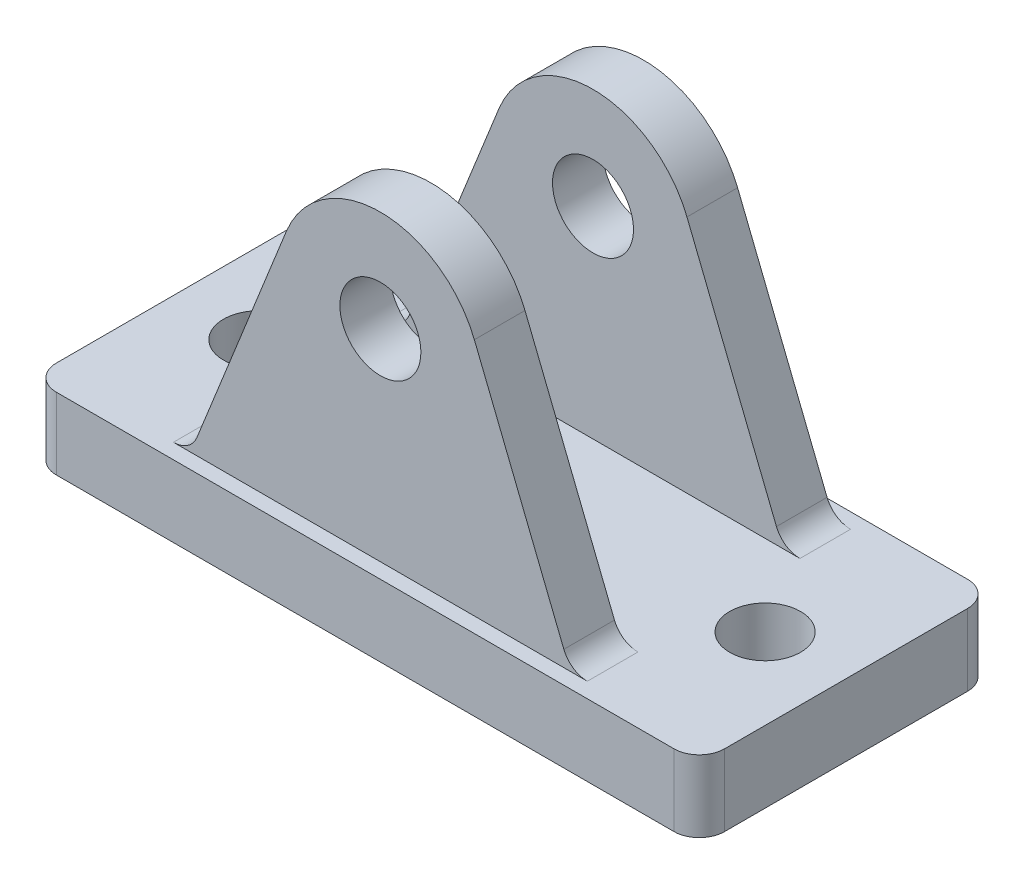
ISO-10303-21;
HEADER;
FILE_DESCRIPTION(('STEP AP214'),'2;1');
FILE_NAME('part.step','',(''),(''),'','','');
FILE_SCHEMA(('AUTOMOTIVE_DESIGN { 1 0 10303 214 1 1 1 1 }'));
ENDSEC;
DATA;
#1=APPLICATION_CONTEXT('core data for automotive mechanical design processes');
#2=APPLICATION_PROTOCOL_DEFINITION('international standard','automotive_design',2000,#1);
#3=PRODUCT_CONTEXT('',#1,'mechanical');
#4=PRODUCT('Part','Part','',(#3));
#5=PRODUCT_RELATED_PRODUCT_CATEGORY('part','',(#4));
#6=PRODUCT_DEFINITION_FORMATION('','',#4);
#7=PRODUCT_DEFINITION_CONTEXT('part definition',#1,'design');
#8=PRODUCT_DEFINITION('design','',#6,#7);
#9=PRODUCT_DEFINITION_SHAPE('','',#8);
#10=(LENGTH_UNIT() NAMED_UNIT(*) SI_UNIT(.MILLI.,.METRE.));
#11=(NAMED_UNIT(*) PLANE_ANGLE_UNIT() SI_UNIT($,.RADIAN.));
#12=(NAMED_UNIT(*) SI_UNIT($,.STERADIAN.) SOLID_ANGLE_UNIT());
#13=UNCERTAINTY_MEASURE_WITH_UNIT(LENGTH_MEASURE(1.E-05),#10,'distance_accuracy_value','');
#14=(GEOMETRIC_REPRESENTATION_CONTEXT(3) GLOBAL_UNCERTAINTY_ASSIGNED_CONTEXT((#13)) GLOBAL_UNIT_ASSIGNED_CONTEXT((#10,
#11,#12)) REPRESENTATION_CONTEXT('',''));
#15=CARTESIAN_POINT('',(0.,0.,0.));
#16=DIRECTION('',(0.,0.,1.));
#17=DIRECTION('',(1.,0.,0.));
#18=AXIS2_PLACEMENT_3D('',#15,#16,#17);
#19=CARTESIAN_POINT('',(0.,14.1675953124891,0.));
#20=DIRECTION('',(0.,-1.,0.));
#21=DIRECTION('',(0.,0.,-1.));
#22=AXIS2_PLACEMENT_3D('',#19,#20,#21);
#23=PLANE('',#22);
#24=DIRECTION('',(1.,0.,0.));
#25=VECTOR('',#24,1.);
#26=CARTESIAN_POINT('',(37.5,14.1675953124891,-16.));
#27=LINE('',#26,#25);
#28=CARTESIAN_POINT('',(-40.8834112643357,14.1675953124891,-16.));
#29=VERTEX_POINT('',#28);
#30=CARTESIAN_POINT('',(40.8834112643357,14.1675953124891,-16.));
#31=VERTEX_POINT('',#30);
#32=EDGE_CURVE('E189',#29,#31,#27,.T.);
#33=ORIENTED_EDGE('',*,*,#32,.F.);
#34=DIRECTION('',(0.,0.,1.));
#35=VECTOR('',#34,1.);
#36=CARTESIAN_POINT('',(-40.8834112643357,14.1675953124891,0.));
#37=LINE('',#36,#35);
#38=CARTESIAN_POINT('',(-40.8834112643357,14.1675953124891,-26.));
#39=VERTEX_POINT('',#38);
#40=EDGE_CURVE('E302',#29,#39,#37,.F.);
#41=ORIENTED_EDGE('',*,*,#40,.T.);
#42=DIRECTION('',(1.,0.,0.));
#43=VECTOR('',#42,1.);
#44=CARTESIAN_POINT('',(37.5,14.1675953124891,-26.));
#45=LINE('',#44,#43);
#46=CARTESIAN_POINT('',(40.8834112643357,14.1675953124891,-26.));
#47=VERTEX_POINT('',#46);
#48=EDGE_CURVE('E197',#39,#47,#45,.T.);
#49=ORIENTED_EDGE('',*,*,#48,.T.);
#50=DIRECTION('',(0.,0.,1.));
#51=VECTOR('',#50,1.);
#52=CARTESIAN_POINT('',(40.8834112643357,14.1675953124891,0.));
#53=LINE('',#52,#51);
#54=EDGE_CURVE('E299',#47,#31,#53,.T.);
#55=ORIENTED_EDGE('',*,*,#54,.T.);
#56=EDGE_LOOP('',(#33,#41,#49,#55));
#57=FACE_BOUND('',#56,.T.);
#58=DIRECTION('',(1.,0.,0.));
#59=VECTOR('',#58,1.);
#60=CARTESIAN_POINT('',(-66.,14.1675953124891,-29.));
#61=LINE('',#60,#59);
#62=CARTESIAN_POINT('',(-61.,14.1675953124891,-29.));
#63=VERTEX_POINT('',#62);
#64=CARTESIAN_POINT('',(61.,14.1675953124891,-29.));
#65=VERTEX_POINT('',#64);
#66=EDGE_CURVE('E263',#63,#65,#61,.T.);
#67=ORIENTED_EDGE('',*,*,#66,.F.);
#68=CARTESIAN_POINT('',(-61.,14.1675953124891,-24.));
#69=DIRECTION('',(0.,-1.,0.));
#70=DIRECTION('',(0.,0.,-1.));
#71=AXIS2_PLACEMENT_3D('',#68,#69,#70);
#72=CIRCLE('',#71,5.);
#73=CARTESIAN_POINT('',(-66.,14.1675953124891,-24.));
#74=VERTEX_POINT('',#73);
#75=EDGE_CURVE('E291',#63,#74,#72,.F.);
#76=ORIENTED_EDGE('',*,*,#75,.T.);
#77=DIRECTION('',(0.,0.,-1.));
#78=VECTOR('',#77,1.);
#79=CARTESIAN_POINT('',(-66.,14.1675953124891,29.));
#80=LINE('',#79,#78);
#81=CARTESIAN_POINT('',(-66.,14.1675953124891,24.));
#82=VERTEX_POINT('',#81);
#83=EDGE_CURVE('E260',#82,#74,#80,.T.);
#84=ORIENTED_EDGE('',*,*,#83,.F.);
#85=CARTESIAN_POINT('',(-61.,14.1675953124891,24.));
#86=DIRECTION('',(0.,-1.,0.));
#87=DIRECTION('',(0.,0.,-1.));
#88=AXIS2_PLACEMENT_3D('',#85,#86,#87);
#89=CIRCLE('',#88,5.);
#90=CARTESIAN_POINT('',(-61.,14.1675953124891,29.));
#91=VERTEX_POINT('',#90);
#92=EDGE_CURVE('E287',#82,#91,#89,.F.);
#93=ORIENTED_EDGE('',*,*,#92,.T.);
#94=DIRECTION('',(1.,0.,0.));
#95=VECTOR('',#94,1.);
#96=CARTESIAN_POINT('',(-66.,14.1675953124891,29.));
#97=LINE('',#96,#95);
#98=CARTESIAN_POINT('',(61.,14.1675953124891,29.));
#99=VERTEX_POINT('',#98);
#100=EDGE_CURVE('E270',#91,#99,#97,.T.);
#101=ORIENTED_EDGE('',*,*,#100,.T.);
#102=CARTESIAN_POINT('',(61.,14.1675953124891,24.));
#103=DIRECTION('',(0.,-1.,0.));
#104=DIRECTION('',(0.,0.,-1.));
#105=AXIS2_PLACEMENT_3D('',#102,#103,#104);
#106=CIRCLE('',#105,5.);
#107=CARTESIAN_POINT('',(66.,14.1675953124891,24.));
#108=VERTEX_POINT('',#107);
#109=EDGE_CURVE('E285',#99,#108,#106,.F.);
#110=ORIENTED_EDGE('',*,*,#109,.T.);
#111=DIRECTION('',(0.,0.,-1.));
#112=VECTOR('',#111,1.);
#113=CARTESIAN_POINT('',(66.,14.1675953124891,29.));
#114=LINE('',#113,#112);
#115=CARTESIAN_POINT('',(66.,14.1675953124891,-24.));
#116=VERTEX_POINT('',#115);
#117=EDGE_CURVE('E267',#108,#116,#114,.T.);
#118=ORIENTED_EDGE('',*,*,#117,.T.);
#119=CARTESIAN_POINT('',(61.,14.1675953124891,-24.));
#120=DIRECTION('',(0.,-1.,0.));
#121=DIRECTION('',(0.,0.,-1.));
#122=AXIS2_PLACEMENT_3D('',#119,#120,#121);
#123=CIRCLE('',#122,5.);
#124=EDGE_CURVE('E289',#116,#65,#123,.F.);
#125=ORIENTED_EDGE('',*,*,#124,.T.);
#126=EDGE_LOOP('',(#67,#76,#84,#93,#101,#110,#118,#125));
#127=FACE_BOUND('',#126,.T.);
#128=CARTESIAN_POINT('',(50.,14.1675953124891,0.));
#129=DIRECTION('',(0.,1.,0.));
#130=DIRECTION('',(0.,0.,-1.));
#131=AXIS2_PLACEMENT_3D('',#128,#129,#130);
#132=CIRCLE('',#131,7.);
#133=CARTESIAN_POINT('',(50.,14.1675953124891,-7.));
#134=VERTEX_POINT('',#133);
#135=EDGE_CURVE('E255',#134,#134,#132,.T.);
#136=ORIENTED_EDGE('',*,*,#135,.F.);
#137=EDGE_LOOP('',(#136));
#138=FACE_BOUND('',#137,.T.);
#139=CARTESIAN_POINT('',(-50.,14.1675953124891,0.));
#140=DIRECTION('',(0.,1.,0.));
#141=DIRECTION('',(0.,0.,1.));
#142=AXIS2_PLACEMENT_3D('',#139,#140,#141);
#143=CIRCLE('',#142,7.);
#144=CARTESIAN_POINT('',(-50.,14.1675953124891,7.));
#145=VERTEX_POINT('',#144);
#146=EDGE_CURVE('E252',#145,#145,#143,.T.);
#147=ORIENTED_EDGE('',*,*,#146,.F.);
#148=EDGE_LOOP('',(#147));
#149=FACE_BOUND('',#148,.T.);
#150=DIRECTION('',(1.,0.,0.));
#151=VECTOR('',#150,1.);
#152=CARTESIAN_POINT('',(37.5,14.1675953124891,16.));
#153=LINE('',#152,#151);
#154=CARTESIAN_POINT('',(-40.8834112643357,14.1675953124891,16.));
#155=VERTEX_POINT('',#154);
#156=CARTESIAN_POINT('',(40.8834112643357,14.1675953124891,16.));
#157=VERTEX_POINT('',#156);
#158=EDGE_CURVE('E227',#155,#157,#153,.T.);
#159=ORIENTED_EDGE('',*,*,#158,.T.);
#160=DIRECTION('',(0.,0.,-1.));
#161=VECTOR('',#160,1.);
#162=CARTESIAN_POINT('',(40.8834112643357,14.1675953124891,26.));
#163=LINE('',#162,#161);
#164=CARTESIAN_POINT('',(40.8834112643357,14.1675953124891,26.));
#165=VERTEX_POINT('',#164);
#166=EDGE_CURVE('E296',#157,#165,#163,.F.);
#167=ORIENTED_EDGE('',*,*,#166,.T.);
#168=DIRECTION('',(1.,0.,0.));
#169=VECTOR('',#168,1.);
#170=CARTESIAN_POINT('',(37.5,14.1675953124891,26.));
#171=LINE('',#170,#169);
#172=CARTESIAN_POINT('',(-40.8834112643357,14.1675953124891,26.));
#173=VERTEX_POINT('',#172);
#174=EDGE_CURVE('E232',#173,#165,#171,.T.);
#175=ORIENTED_EDGE('',*,*,#174,.F.);
#176=DIRECTION('',(0.,0.,-1.));
#177=VECTOR('',#176,1.);
#178=CARTESIAN_POINT('',(-40.8834112643357,14.1675953124891,16.));
#179=LINE('',#178,#177);
#180=EDGE_CURVE('E293',#173,#155,#179,.T.);
#181=ORIENTED_EDGE('',*,*,#180,.T.);
#182=EDGE_LOOP('',(#159,#167,#175,#181));
#183=FACE_BOUND('',#182,.T.);
#184=ADVANCED_FACE('F37',(#57,#127,#138,#149,#183),#23,.F.);
#185=CARTESIAN_POINT('',(-66.,14.1675953124891,29.));
#186=DIRECTION('',(-1.,0.,0.));
#187=DIRECTION('',(0.,0.,1.));
#188=AXIS2_PLACEMENT_3D('',#185,#186,#187);
#189=PLANE('',#188);
#190=ORIENTED_EDGE('',*,*,#83,.T.);
#191=DIRECTION('',(0.,-1.,0.));
#192=VECTOR('',#191,1.);
#193=CARTESIAN_POINT('',(-66.,14.1675953124891,-24.));
#194=LINE('',#193,#192);
#195=CARTESIAN_POINT('',(-66.,0.,-24.));
#196=VERTEX_POINT('',#195);
#197=EDGE_CURVE('E313',#74,#196,#194,.T.);
#198=ORIENTED_EDGE('',*,*,#197,.T.);
#199=DIRECTION('',(0.,0.,-1.));
#200=VECTOR('',#199,1.);
#201=CARTESIAN_POINT('',(-66.,0.,29.));
#202=LINE('',#201,#200);
#203=CARTESIAN_POINT('',(-66.,0.,24.));
#204=VERTEX_POINT('',#203);
#205=EDGE_CURVE('E251',#204,#196,#202,.T.);
#206=ORIENTED_EDGE('',*,*,#205,.F.);
#207=DIRECTION('',(0.,-1.,0.));
#208=VECTOR('',#207,1.);
#209=CARTESIAN_POINT('',(-66.,14.1675953124891,24.));
#210=LINE('',#209,#208);
#211=EDGE_CURVE('E311',#204,#82,#210,.F.);
#212=ORIENTED_EDGE('',*,*,#211,.T.);
#213=EDGE_LOOP('',(#190,#198,#206,#212));
#214=FACE_BOUND('',#213,.T.);
#215=ADVANCED_FACE('F380',(#214),#189,.T.);
#216=CARTESIAN_POINT('',(-66.,14.1675953124891,29.));
#217=DIRECTION('',(0.,0.,-1.));
#218=DIRECTION('',(-1.,0.,0.));
#219=AXIS2_PLACEMENT_3D('',#216,#217,#218);
#220=PLANE('',#219);
#221=ORIENTED_EDGE('',*,*,#100,.F.);
#222=DIRECTION('',(0.,-1.,0.));
#223=VECTOR('',#222,1.);
#224=CARTESIAN_POINT('',(-61.,0.,29.));
#225=LINE('',#224,#223);
#226=CARTESIAN_POINT('',(-61.,0.,29.));
#227=VERTEX_POINT('',#226);
#228=EDGE_CURVE('E334',#91,#227,#225,.T.);
#229=ORIENTED_EDGE('',*,*,#228,.T.);
#230=DIRECTION('',(1.,0.,0.));
#231=VECTOR('',#230,1.);
#232=CARTESIAN_POINT('',(-66.,0.,29.));
#233=LINE('',#232,#231);
#234=CARTESIAN_POINT('',(61.,0.,29.));
#235=VERTEX_POINT('',#234);
#236=EDGE_CURVE('E264',#227,#235,#233,.T.);
#237=ORIENTED_EDGE('',*,*,#236,.T.);
#238=DIRECTION('',(0.,-1.,0.));
#239=VECTOR('',#238,1.);
#240=CARTESIAN_POINT('',(61.,14.1675953124891,29.));
#241=LINE('',#240,#239);
#242=EDGE_CURVE('E332',#235,#99,#241,.F.);
#243=ORIENTED_EDGE('',*,*,#242,.T.);
#244=EDGE_LOOP('',(#221,#229,#237,#243));
#245=FACE_BOUND('',#244,.T.);
#246=ADVANCED_FACE('F386',(#245),#220,.F.);
#247=CARTESIAN_POINT('',(66.,14.1675953124891,29.));
#248=DIRECTION('',(-1.,0.,0.));
#249=DIRECTION('',(0.,0.,1.));
#250=AXIS2_PLACEMENT_3D('',#247,#248,#249);
#251=PLANE('',#250);
#252=DIRECTION('',(0.,0.,-1.));
#253=VECTOR('',#252,1.);
#254=CARTESIAN_POINT('',(66.,0.,29.));
#255=LINE('',#254,#253);
#256=CARTESIAN_POINT('',(66.,0.,24.));
#257=VERTEX_POINT('',#256);
#258=CARTESIAN_POINT('',(66.,0.,-24.));
#259=VERTEX_POINT('',#258);
#260=EDGE_CURVE('E279',#257,#259,#255,.T.);
#261=ORIENTED_EDGE('',*,*,#260,.T.);
#262=DIRECTION('',(0.,-1.,0.));
#263=VECTOR('',#262,1.);
#264=CARTESIAN_POINT('',(66.,14.1675953124891,-24.));
#265=LINE('',#264,#263);
#266=EDGE_CURVE('E330',#259,#116,#265,.F.);
#267=ORIENTED_EDGE('',*,*,#266,.T.);
#268=ORIENTED_EDGE('',*,*,#117,.F.);
#269=DIRECTION('',(0.,-1.,0.));
#270=VECTOR('',#269,1.);
#271=CARTESIAN_POINT('',(66.,14.1675953124891,24.));
#272=LINE('',#271,#270);
#273=EDGE_CURVE('E327',#108,#257,#272,.T.);
#274=ORIENTED_EDGE('',*,*,#273,.T.);
#275=EDGE_LOOP('',(#261,#267,#268,#274));
#276=FACE_BOUND('',#275,.T.);
#277=ADVANCED_FACE('F401',(#276),#251,.F.);
#278=CARTESIAN_POINT('',(-66.,14.1675953124891,-29.));
#279=DIRECTION('',(0.,0.,-1.));
#280=DIRECTION('',(-1.,0.,0.));
#281=AXIS2_PLACEMENT_3D('',#278,#279,#280);
#282=PLANE('',#281);
#283=DIRECTION('',(1.,0.,0.));
#284=VECTOR('',#283,1.);
#285=CARTESIAN_POINT('',(-66.,0.,-29.));
#286=LINE('',#285,#284);
#287=CARTESIAN_POINT('',(-61.,0.,-29.));
#288=VERTEX_POINT('',#287);
#289=CARTESIAN_POINT('',(61.,0.,-29.));
#290=VERTEX_POINT('',#289);
#291=EDGE_CURVE('E276',#288,#290,#286,.T.);
#292=ORIENTED_EDGE('',*,*,#291,.F.);
#293=DIRECTION('',(0.,-1.,0.));
#294=VECTOR('',#293,1.);
#295=CARTESIAN_POINT('',(-61.,14.1675953124891,-29.));
#296=LINE('',#295,#294);
#297=EDGE_CURVE('E325',#288,#63,#296,.F.);
#298=ORIENTED_EDGE('',*,*,#297,.T.);
#299=ORIENTED_EDGE('',*,*,#66,.T.);
#300=DIRECTION('',(0.,-1.,0.));
#301=VECTOR('',#300,1.);
#302=CARTESIAN_POINT('',(61.,0.,-29.));
#303=LINE('',#302,#301);
#304=EDGE_CURVE('E322',#65,#290,#303,.T.);
#305=ORIENTED_EDGE('',*,*,#304,.T.);
#306=EDGE_LOOP('',(#292,#298,#299,#305));
#307=FACE_BOUND('',#306,.T.);
#308=ADVANCED_FACE('F397',(#307),#282,.T.);
#309=CARTESIAN_POINT('',(0.,0.,0.));
#310=DIRECTION('',(0.,-1.,0.));
#311=DIRECTION('',(0.,0.,-1.));
#312=AXIS2_PLACEMENT_3D('',#309,#310,#311);
#313=PLANE('',#312);
#314=CARTESIAN_POINT('',(-50.,0.,0.));
#315=DIRECTION('',(0.,1.,0.));
#316=DIRECTION('',(0.,0.,1.));
#317=AXIS2_PLACEMENT_3D('',#314,#315,#316);
#318=CIRCLE('',#317,7.);
#319=CARTESIAN_POINT('',(-50.,0.,7.));
#320=VERTEX_POINT('',#319);
#321=EDGE_CURVE('E248',#320,#320,#318,.T.);
#322=ORIENTED_EDGE('',*,*,#321,.T.);
#323=EDGE_LOOP('',(#322));
#324=FACE_BOUND('',#323,.T.);
#325=CARTESIAN_POINT('',(50.,0.,0.));
#326=DIRECTION('',(0.,1.,0.));
#327=DIRECTION('',(0.,0.,-1.));
#328=AXIS2_PLACEMENT_3D('',#325,#326,#327);
#329=CIRCLE('',#328,7.);
#330=CARTESIAN_POINT('',(50.,0.,-7.));
#331=VERTEX_POINT('',#330);
#332=EDGE_CURVE('E247',#331,#331,#329,.T.);
#333=ORIENTED_EDGE('',*,*,#332,.T.);
#334=EDGE_LOOP('',(#333));
#335=FACE_BOUND('',#334,.T.);
#336=ORIENTED_EDGE('',*,*,#205,.T.);
#337=CARTESIAN_POINT('',(-61.,0.,-24.));
#338=DIRECTION('',(0.,-1.,0.));
#339=DIRECTION('',(0.,0.,-1.));
#340=AXIS2_PLACEMENT_3D('',#337,#338,#339);
#341=CIRCLE('',#340,5.);
#342=EDGE_CURVE('E320',#196,#288,#341,.T.);
#343=ORIENTED_EDGE('',*,*,#342,.T.);
#344=ORIENTED_EDGE('',*,*,#291,.T.);
#345=CARTESIAN_POINT('',(61.,0.,-24.));
#346=DIRECTION('',(0.,-1.,0.));
#347=DIRECTION('',(0.,0.,-1.));
#348=AXIS2_PLACEMENT_3D('',#345,#346,#347);
#349=CIRCLE('',#348,5.);
#350=EDGE_CURVE('E318',#290,#259,#349,.T.);
#351=ORIENTED_EDGE('',*,*,#350,.T.);
#352=ORIENTED_EDGE('',*,*,#260,.F.);
#353=CARTESIAN_POINT('',(61.,0.,24.));
#354=DIRECTION('',(0.,-1.,0.));
#355=DIRECTION('',(0.,0.,-1.));
#356=AXIS2_PLACEMENT_3D('',#353,#354,#355);
#357=CIRCLE('',#356,5.);
#358=EDGE_CURVE('E52',#257,#235,#357,.T.);
#359=ORIENTED_EDGE('',*,*,#358,.T.);
#360=ORIENTED_EDGE('',*,*,#236,.F.);
#361=CARTESIAN_POINT('',(-61.,0.,24.));
#362=DIRECTION('',(0.,-1.,0.));
#363=DIRECTION('',(0.,0.,-1.));
#364=AXIS2_PLACEMENT_3D('',#361,#362,#363);
#365=CIRCLE('',#364,5.);
#366=EDGE_CURVE('E60',#227,#204,#365,.T.);
#367=ORIENTED_EDGE('',*,*,#366,.T.);
#368=EDGE_LOOP('',(#336,#343,#344,#351,#352,#359,#360,#367));
#369=FACE_BOUND('',#368,.T.);
#370=ADVANCED_FACE('F394',(#324,#335,#369),#313,.T.);
#371=CARTESIAN_POINT('',(50.,0.,0.));
#372=DIRECTION('',(0.,1.,0.));
#373=DIRECTION('',(0.,0.,1.));
#374=AXIS2_PLACEMENT_3D('',#371,#372,#373);
#375=CYLINDRICAL_SURFACE('',#374,7.);
#376=ORIENTED_EDGE('',*,*,#332,.F.);
#377=EDGE_LOOP('',(#376));
#378=FACE_BOUND('',#377,.T.);
#379=ORIENTED_EDGE('',*,*,#135,.T.);
#380=EDGE_LOOP('',(#379));
#381=FACE_BOUND('',#380,.T.);
#382=ADVANCED_FACE('F392',(#378,#381),#375,.F.);
#383=CARTESIAN_POINT('',(-50.,0.,0.));
#384=DIRECTION('',(0.,1.,0.));
#385=DIRECTION('',(0.,0.,1.));
#386=AXIS2_PLACEMENT_3D('',#383,#384,#385);
#387=CYLINDRICAL_SURFACE('',#386,7.);
#388=ORIENTED_EDGE('',*,*,#321,.F.);
#389=EDGE_LOOP('',(#388));
#390=FACE_BOUND('',#389,.T.);
#391=ORIENTED_EDGE('',*,*,#146,.T.);
#392=EDGE_LOOP('',(#391));
#393=FACE_BOUND('',#392,.T.);
#394=ADVANCED_FACE('F456',(#390,#393),#387,.F.);
#395=CARTESIAN_POINT('',(18.5659586180403,61.4367452957067,26.));
#396=DIRECTION('',(-0.928297930902023,-0.371837264785315,0.));
#397=DIRECTION('',(0.371837264785315,-0.928297930902022,0.));
#398=AXIS2_PLACEMENT_3D('',#395,#396,#397);
#399=PLANE('',#398);
#400=DIRECTION('',(-0.371837264785315,0.928297930902022,0.));
#401=VECTOR('',#400,1.);
#402=CARTESIAN_POINT('',(18.5659586180403,61.4367452957067,26.));
#403=LINE('',#402,#401);
#404=CARTESIAN_POINT('',(36.2419216098256,17.3084089885625,26.));
#405=VERTEX_POINT('',#404);
#406=CARTESIAN_POINT('',(18.5659586180403,61.4367452957067,26.));
#407=VERTEX_POINT('',#406);
#408=EDGE_CURVE('E224',#405,#407,#403,.T.);
#409=ORIENTED_EDGE('',*,*,#408,.F.);
#410=DIRECTION('',(0.,0.,-1.));
#411=VECTOR('',#410,1.);
#412=CARTESIAN_POINT('',(36.2419216098256,17.3084089885625,16.));
#413=LINE('',#412,#411);
#414=CARTESIAN_POINT('',(36.2419216098256,17.3084089885625,16.));
#415=VERTEX_POINT('',#414);
#416=EDGE_CURVE('E306',#405,#415,#413,.T.);
#417=ORIENTED_EDGE('',*,*,#416,.T.);
#418=DIRECTION('',(-0.371837264785315,0.928297930902022,0.));
#419=VECTOR('',#418,1.);
#420=CARTESIAN_POINT('',(18.5659586180403,61.4367452957067,16.));
#421=LINE('',#420,#419);
#422=CARTESIAN_POINT('',(18.5659586180403,61.4367452957067,16.));
#423=VERTEX_POINT('',#422);
#424=EDGE_CURVE('E221',#415,#423,#421,.T.);
#425=ORIENTED_EDGE('',*,*,#424,.T.);
#426=DIRECTION('',(0.,0.,-1.));
#427=VECTOR('',#426,1.);
#428=CARTESIAN_POINT('',(18.5659586180403,61.4367452957067,26.));
#429=LINE('',#428,#427);
#430=EDGE_CURVE('E244',#407,#423,#429,.T.);
#431=ORIENTED_EDGE('',*,*,#430,.F.);
#432=EDGE_LOOP('',(#409,#417,#425,#431));
#433=FACE_BOUND('',#432,.T.);
#434=ADVANCED_FACE('F373',(#433),#399,.F.);
#435=CARTESIAN_POINT('',(0.,54.,26.));
#436=DIRECTION('',(0.,0.,-1.));
#437=DIRECTION('',(-1.,0.,0.));
#438=AXIS2_PLACEMENT_3D('',#435,#436,#437);
#439=CYLINDRICAL_SURFACE('',#438,20.);
#440=CARTESIAN_POINT('',(0.,54.,16.));
#441=DIRECTION('',(0.,0.,1.));
#442=DIRECTION('',(-1.,0.,0.));
#443=AXIS2_PLACEMENT_3D('',#440,#441,#442);
#444=CIRCLE('',#443,20.);
#445=CARTESIAN_POINT('',(-18.5659586180403,61.4367452957067,16.));
#446=VERTEX_POINT('',#445);
#447=EDGE_CURVE('E236',#423,#446,#444,.T.);
#448=ORIENTED_EDGE('',*,*,#447,.T.);
#449=DIRECTION('',(0.,0.,-1.));
#450=VECTOR('',#449,1.);
#451=CARTESIAN_POINT('',(-18.5659586180403,61.4367452957067,26.));
#452=LINE('',#451,#450);
#453=CARTESIAN_POINT('',(-18.5659586180403,61.4367452957067,26.));
#454=VERTEX_POINT('',#453);
#455=EDGE_CURVE('E234',#454,#446,#452,.T.);
#456=ORIENTED_EDGE('',*,*,#455,.F.);
#457=CARTESIAN_POINT('',(0.,54.,26.));
#458=DIRECTION('',(0.,0.,1.));
#459=DIRECTION('',(-1.,0.,0.));
#460=AXIS2_PLACEMENT_3D('',#457,#458,#459);
#461=CIRCLE('',#460,20.);
#462=EDGE_CURVE('E226',#407,#454,#461,.T.);
#463=ORIENTED_EDGE('',*,*,#462,.F.);
#464=ORIENTED_EDGE('',*,*,#430,.T.);
#465=EDGE_LOOP('',(#448,#456,#463,#464));
#466=FACE_BOUND('',#465,.T.);
#467=ADVANCED_FACE('F370',(#466),#439,.T.);
#468=CARTESIAN_POINT('',(-37.5,14.1675953124891,26.));
#469=DIRECTION('',(0.928297930902022,-0.371837264785315,0.));
#470=DIRECTION('',(0.371837264785315,0.928297930902022,0.));
#471=AXIS2_PLACEMENT_3D('',#468,#469,#470);
#472=PLANE('',#471);
#473=DIRECTION('',(-0.371837264785315,-0.928297930902022,0.));
#474=VECTOR('',#473,1.);
#475=CARTESIAN_POINT('',(-37.5,14.1675953124891,16.));
#476=LINE('',#475,#474);
#477=CARTESIAN_POINT('',(-36.2419216098256,17.3084089885625,16.));
#478=VERTEX_POINT('',#477);
#479=EDGE_CURVE('E238',#446,#478,#476,.T.);
#480=ORIENTED_EDGE('',*,*,#479,.T.);
#481=DIRECTION('',(0.,0.,-1.));
#482=VECTOR('',#481,1.);
#483=CARTESIAN_POINT('',(-36.2419216098256,17.3084089885625,26.));
#484=LINE('',#483,#482);
#485=CARTESIAN_POINT('',(-36.2419216098256,17.3084089885625,26.));
#486=VERTEX_POINT('',#485);
#487=EDGE_CURVE('E309',#478,#486,#484,.F.);
#488=ORIENTED_EDGE('',*,*,#487,.T.);
#489=DIRECTION('',(-0.371837264785315,-0.928297930902022,0.));
#490=VECTOR('',#489,1.);
#491=CARTESIAN_POINT('',(-37.5,14.1675953124891,26.));
#492=LINE('',#491,#490);
#493=EDGE_CURVE('E229',#454,#486,#492,.T.);
#494=ORIENTED_EDGE('',*,*,#493,.F.);
#495=ORIENTED_EDGE('',*,*,#455,.T.);
#496=EDGE_LOOP('',(#480,#488,#494,#495));
#497=FACE_BOUND('',#496,.T.);
#498=ADVANCED_FACE('F359',(#497),#472,.F.);
#499=CARTESIAN_POINT('',(0.,54.,26.));
#500=DIRECTION('',(0.,0.,-1.));
#501=DIRECTION('',(-1.,0.,0.));
#502=AXIS2_PLACEMENT_3D('',#499,#500,#501);
#503=PLANE('',#502);
#504=CARTESIAN_POINT('',(0.,54.,26.));
#505=DIRECTION('',(0.,0.,1.));
#506=DIRECTION('',(1.,0.,0.));
#507=AXIS2_PLACEMENT_3D('',#504,#505,#506);
#508=CIRCLE('',#507,8.);
#509=CARTESIAN_POINT('',(8.,54.,26.));
#510=VERTEX_POINT('',#509);
#511=EDGE_CURVE('E218',#510,#510,#508,.T.);
#512=ORIENTED_EDGE('',*,*,#511,.F.);
#513=EDGE_LOOP('',(#512));
#514=FACE_BOUND('',#513,.T.);
#515=ORIENTED_EDGE('',*,*,#174,.T.);
#516=CARTESIAN_POINT('',(40.8834112643357,19.1675953124891,26.));
#517=DIRECTION('',(0.,0.,-1.));
#518=DIRECTION('',(-1.,0.,0.));
#519=AXIS2_PLACEMENT_3D('',#516,#517,#518);
#520=CIRCLE('',#519,5.);
#521=EDGE_CURVE('E348',#165,#405,#520,.T.);
#522=ORIENTED_EDGE('',*,*,#521,.T.);
#523=ORIENTED_EDGE('',*,*,#408,.T.);
#524=ORIENTED_EDGE('',*,*,#462,.T.);
#525=ORIENTED_EDGE('',*,*,#493,.T.);
#526=CARTESIAN_POINT('',(-40.8834112643357,19.1675953124891,26.));
#527=DIRECTION('',(0.,0.,-1.));
#528=DIRECTION('',(-1.,0.,0.));
#529=AXIS2_PLACEMENT_3D('',#526,#527,#528);
#530=CIRCLE('',#529,5.);
#531=EDGE_CURVE('E11',#486,#173,#530,.T.);
#532=ORIENTED_EDGE('',*,*,#531,.T.);
#533=EDGE_LOOP('',(#515,#522,#523,#524,#525,#532));
#534=FACE_BOUND('',#533,.T.);
#535=ADVANCED_FACE('F365',(#514,#534),#503,.F.);
#536=CARTESIAN_POINT('',(0.,54.,16.));
#537=DIRECTION('',(0.,0.,-1.));
#538=DIRECTION('',(-1.,0.,0.));
#539=AXIS2_PLACEMENT_3D('',#536,#537,#538);
#540=PLANE('',#539);
#541=CARTESIAN_POINT('',(0.,54.,16.));
#542=DIRECTION('',(0.,0.,-1.));
#543=DIRECTION('',(-1.,0.,0.));
#544=AXIS2_PLACEMENT_3D('',#541,#542,#543);
#545=CIRCLE('',#544,8.);
#546=CARTESIAN_POINT('',(-8.,54.,16.));
#547=VERTEX_POINT('',#546);
#548=EDGE_CURVE('E216',#547,#547,#545,.F.);
#549=ORIENTED_EDGE('',*,*,#548,.T.);
#550=EDGE_LOOP('',(#549));
#551=FACE_BOUND('',#550,.T.);
#552=ORIENTED_EDGE('',*,*,#424,.F.);
#553=CARTESIAN_POINT('',(40.8834112643357,19.1675953124891,16.));
#554=DIRECTION('',(0.,0.,-1.));
#555=DIRECTION('',(-1.,0.,0.));
#556=AXIS2_PLACEMENT_3D('',#553,#554,#555);
#557=CIRCLE('',#556,5.);
#558=EDGE_CURVE('E345',#415,#157,#557,.F.);
#559=ORIENTED_EDGE('',*,*,#558,.T.);
#560=ORIENTED_EDGE('',*,*,#158,.F.);
#561=CARTESIAN_POINT('',(-40.8834112643357,19.1675953124891,16.));
#562=DIRECTION('',(0.,0.,-1.));
#563=DIRECTION('',(-1.,0.,0.));
#564=AXIS2_PLACEMENT_3D('',#561,#562,#563);
#565=CIRCLE('',#564,5.);
#566=EDGE_CURVE('E45',#155,#478,#565,.F.);
#567=ORIENTED_EDGE('',*,*,#566,.T.);
#568=ORIENTED_EDGE('',*,*,#479,.F.);
#569=ORIENTED_EDGE('',*,*,#447,.F.);
#570=EDGE_LOOP('',(#552,#559,#560,#567,#568,#569));
#571=FACE_BOUND('',#570,.T.);
#572=ADVANCED_FACE('F353',(#551,#571),#540,.T.);
#573=CARTESIAN_POINT('',(0.,54.,-29.001));
#574=DIRECTION('',(0.,0.,1.));
#575=DIRECTION('',(1.,0.,0.));
#576=AXIS2_PLACEMENT_3D('',#573,#574,#575);
#577=CYLINDRICAL_SURFACE('',#576,8.);
#578=ORIENTED_EDGE('',*,*,#548,.F.);
#579=EDGE_LOOP('',(#578));
#580=FACE_BOUND('',#579,.T.);
#581=ORIENTED_EDGE('',*,*,#511,.T.);
#582=EDGE_LOOP('',(#581));
#583=FACE_BOUND('',#582,.T.);
#584=ADVANCED_FACE('F473',(#580,#583),#577,.F.);
#585=CARTESIAN_POINT('',(18.5659586180403,61.4367452957067,-26.));
#586=DIRECTION('',(0.928297930902023,0.371837264785315,0.));
#587=DIRECTION('',(-0.371837264785315,0.928297930902022,0.));
#588=AXIS2_PLACEMENT_3D('',#585,#586,#587);
#589=PLANE('',#588);
#590=DIRECTION('',(-0.371837264785315,0.928297930902022,0.));
#591=VECTOR('',#590,1.);
#592=CARTESIAN_POINT('',(18.5659586180403,61.4367452957067,-16.));
#593=LINE('',#592,#591);
#594=CARTESIAN_POINT('',(36.2419216098256,17.3084089885625,-16.));
#595=VERTEX_POINT('',#594);
#596=CARTESIAN_POINT('',(18.5659586180403,61.4367452957067,-16.));
#597=VERTEX_POINT('',#596);
#598=EDGE_CURVE('E208',#595,#597,#593,.T.);
#599=ORIENTED_EDGE('',*,*,#598,.F.);
#600=DIRECTION('',(0.,0.,1.));
#601=VECTOR('',#600,1.);
#602=CARTESIAN_POINT('',(36.2419216098256,17.3084089885625,-26.));
#603=LINE('',#602,#601);
#604=CARTESIAN_POINT('',(36.2419216098256,17.3084089885625,-26.));
#605=VERTEX_POINT('',#604);
#606=EDGE_CURVE('E183',#595,#605,#603,.F.);
#607=ORIENTED_EDGE('',*,*,#606,.T.);
#608=DIRECTION('',(-0.371837264785315,0.928297930902022,0.));
#609=VECTOR('',#608,1.);
#610=CARTESIAN_POINT('',(18.5659586180403,61.4367452957067,-26.));
#611=LINE('',#610,#609);
#612=CARTESIAN_POINT('',(18.5659586180403,61.4367452957067,-26.));
#613=VERTEX_POINT('',#612);
#614=EDGE_CURVE('E176',#605,#613,#611,.T.);
#615=ORIENTED_EDGE('',*,*,#614,.T.);
#616=DIRECTION('',(0.,0.,1.));
#617=VECTOR('',#616,1.);
#618=CARTESIAN_POINT('',(18.5659586180403,61.4367452957067,-26.));
#619=LINE('',#618,#617);
#620=EDGE_CURVE('E180',#613,#597,#619,.T.);
#621=ORIENTED_EDGE('',*,*,#620,.T.);
#622=EDGE_LOOP('',(#599,#607,#615,#621));
#623=FACE_BOUND('',#622,.T.);
#624=ADVANCED_FACE('F179',(#623),#589,.T.);
#625=CARTESIAN_POINT('',(-37.5,14.1675953124891,-26.));
#626=DIRECTION('',(-0.928297930902022,0.371837264785315,0.));
#627=DIRECTION('',(-0.371837264785315,-0.928297930902022,0.));
#628=AXIS2_PLACEMENT_3D('',#625,#626,#627);
#629=PLANE('',#628);
#630=DIRECTION('',(-0.371837264785315,-0.928297930902022,0.));
#631=VECTOR('',#630,1.);
#632=CARTESIAN_POINT('',(-37.5,14.1675953124891,-26.));
#633=LINE('',#632,#631);
#634=CARTESIAN_POINT('',(-18.5659586180403,61.4367452957067,-26.));
#635=VERTEX_POINT('',#634);
#636=CARTESIAN_POINT('',(-36.2419216098256,17.3084089885625,-26.));
#637=VERTEX_POINT('',#636);
#638=EDGE_CURVE('E202',#635,#637,#633,.T.);
#639=ORIENTED_EDGE('',*,*,#638,.T.);
#640=DIRECTION('',(0.,0.,1.));
#641=VECTOR('',#640,1.);
#642=CARTESIAN_POINT('',(-36.2419216098256,17.3084089885625,-26.));
#643=LINE('',#642,#641);
#644=CARTESIAN_POINT('',(-36.2419216098256,17.3084089885625,-16.));
#645=VERTEX_POINT('',#644);
#646=EDGE_CURVE('E273',#637,#645,#643,.T.);
#647=ORIENTED_EDGE('',*,*,#646,.T.);
#648=DIRECTION('',(-0.371837264785315,-0.928297930902022,0.));
#649=VECTOR('',#648,1.);
#650=CARTESIAN_POINT('',(-37.5,14.1675953124891,-16.));
#651=LINE('',#650,#649);
#652=CARTESIAN_POINT('',(-18.5659586180403,61.4367452957067,-16.));
#653=VERTEX_POINT('',#652);
#654=EDGE_CURVE('E212',#653,#645,#651,.T.);
#655=ORIENTED_EDGE('',*,*,#654,.F.);
#656=DIRECTION('',(0.,0.,1.));
#657=VECTOR('',#656,1.);
#658=CARTESIAN_POINT('',(-18.5659586180403,61.4367452957067,-26.));
#659=LINE('',#658,#657);
#660=EDGE_CURVE('E196',#635,#653,#659,.T.);
#661=ORIENTED_EDGE('',*,*,#660,.F.);
#662=EDGE_LOOP('',(#639,#647,#655,#661));
#663=FACE_BOUND('',#662,.T.);
#664=ADVANCED_FACE('F483',(#663),#629,.T.);
#665=CARTESIAN_POINT('',(0.,54.,-26.));
#666=DIRECTION('',(0.,0.,1.));
#667=DIRECTION('',(1.,0.,0.));
#668=AXIS2_PLACEMENT_3D('',#665,#666,#667);
#669=CYLINDRICAL_SURFACE('',#668,20.);
#670=CARTESIAN_POINT('',(0.,54.,-16.));
#671=DIRECTION('',(0.,0.,1.));
#672=DIRECTION('',(-1.,0.,0.));
#673=AXIS2_PLACEMENT_3D('',#670,#671,#672);
#674=CIRCLE('',#673,20.);
#675=EDGE_CURVE('E195',#597,#653,#674,.T.);
#676=ORIENTED_EDGE('',*,*,#675,.F.);
#677=ORIENTED_EDGE('',*,*,#620,.F.);
#678=CARTESIAN_POINT('',(0.,54.,-26.));
#679=DIRECTION('',(0.,0.,1.));
#680=DIRECTION('',(-1.,0.,0.));
#681=AXIS2_PLACEMENT_3D('',#678,#679,#680);
#682=CIRCLE('',#681,20.);
#683=EDGE_CURVE('E188',#613,#635,#682,.T.);
#684=ORIENTED_EDGE('',*,*,#683,.T.);
#685=ORIENTED_EDGE('',*,*,#660,.T.);
#686=EDGE_LOOP('',(#676,#677,#684,#685));
#687=FACE_BOUND('',#686,.T.);
#688=ADVANCED_FACE('F193',(#687),#669,.T.);
#689=CARTESIAN_POINT('',(0.,54.,-26.));
#690=DIRECTION('',(0.,0.,-1.));
#691=DIRECTION('',(-1.,0.,0.));
#692=AXIS2_PLACEMENT_3D('',#689,#690,#691);
#693=PLANE('',#692);
#694=CARTESIAN_POINT('',(0.,54.,-26.));
#695=DIRECTION('',(0.,0.,-1.));
#696=DIRECTION('',(-1.,0.,0.));
#697=AXIS2_PLACEMENT_3D('',#694,#695,#696);
#698=CIRCLE('',#697,8.);
#699=CARTESIAN_POINT('',(-8.,54.,-26.));
#700=VERTEX_POINT('',#699);
#701=EDGE_CURVE('E503',#700,#700,#698,.T.);
#702=ORIENTED_EDGE('',*,*,#701,.F.);
#703=EDGE_LOOP('',(#702));
#704=FACE_BOUND('',#703,.T.);
#705=ORIENTED_EDGE('',*,*,#614,.F.);
#706=CARTESIAN_POINT('',(40.8834112643357,19.1675953124891,-26.));
#707=DIRECTION('',(0.,0.,-1.));
#708=DIRECTION('',(-1.,0.,0.));
#709=AXIS2_PLACEMENT_3D('',#706,#707,#708);
#710=CIRCLE('',#709,5.);
#711=EDGE_CURVE('E343',#605,#47,#710,.F.);
#712=ORIENTED_EDGE('',*,*,#711,.T.);
#713=ORIENTED_EDGE('',*,*,#48,.F.);
#714=CARTESIAN_POINT('',(-40.8834112643357,19.1675953124891,-26.));
#715=DIRECTION('',(0.,0.,-1.));
#716=DIRECTION('',(-1.,0.,0.));
#717=AXIS2_PLACEMENT_3D('',#714,#715,#716);
#718=CIRCLE('',#717,5.);
#719=EDGE_CURVE('E339',#39,#637,#718,.F.);
#720=ORIENTED_EDGE('',*,*,#719,.T.);
#721=ORIENTED_EDGE('',*,*,#638,.F.);
#722=ORIENTED_EDGE('',*,*,#683,.F.);
#723=EDGE_LOOP('',(#705,#712,#713,#720,#721,#722));
#724=FACE_BOUND('',#723,.T.);
#725=ADVANCED_FACE('F200',(#704,#724),#693,.T.);
#726=CARTESIAN_POINT('',(0.,54.,-16.));
#727=DIRECTION('',(0.,0.,-1.));
#728=DIRECTION('',(-1.,0.,0.));
#729=AXIS2_PLACEMENT_3D('',#726,#727,#728);
#730=PLANE('',#729);
#731=CARTESIAN_POINT('',(0.,54.,-16.));
#732=DIRECTION('',(0.,0.,-1.));
#733=DIRECTION('',(-1.,0.,0.));
#734=AXIS2_PLACEMENT_3D('',#731,#732,#733);
#735=CIRCLE('',#734,8.);
#736=CARTESIAN_POINT('',(-8.,54.,-16.));
#737=VERTEX_POINT('',#736);
#738=EDGE_CURVE('E210',#737,#737,#735,.F.);
#739=ORIENTED_EDGE('',*,*,#738,.F.);
#740=EDGE_LOOP('',(#739));
#741=FACE_BOUND('',#740,.T.);
#742=ORIENTED_EDGE('',*,*,#32,.T.);
#743=CARTESIAN_POINT('',(40.8834112643357,19.1675953124891,-16.));
#744=DIRECTION('',(0.,0.,-1.));
#745=DIRECTION('',(-1.,0.,0.));
#746=AXIS2_PLACEMENT_3D('',#743,#744,#745);
#747=CIRCLE('',#746,5.);
#748=EDGE_CURVE('E341',#31,#595,#747,.T.);
#749=ORIENTED_EDGE('',*,*,#748,.T.);
#750=ORIENTED_EDGE('',*,*,#598,.T.);
#751=ORIENTED_EDGE('',*,*,#675,.T.);
#752=ORIENTED_EDGE('',*,*,#654,.T.);
#753=CARTESIAN_POINT('',(-40.8834112643357,19.1675953124891,-16.));
#754=DIRECTION('',(0.,0.,-1.));
#755=DIRECTION('',(-1.,0.,0.));
#756=AXIS2_PLACEMENT_3D('',#753,#754,#755);
#757=CIRCLE('',#756,5.);
#758=EDGE_CURVE('E336',#645,#29,#757,.T.);
#759=ORIENTED_EDGE('',*,*,#758,.T.);
#760=EDGE_LOOP('',(#742,#749,#750,#751,#752,#759));
#761=FACE_BOUND('',#760,.T.);
#762=ADVANCED_FACE('F489',(#741,#761),#730,.F.);
#763=CARTESIAN_POINT('',(0.,54.,29.001));
#764=DIRECTION('',(0.,0.,-1.));
#765=DIRECTION('',(-1.,0.,0.));
#766=AXIS2_PLACEMENT_3D('',#763,#764,#765);
#767=CYLINDRICAL_SURFACE('',#766,8.);
#768=CARTESIAN_POINT('',(-8.,54.,-26.));
#769=CARTESIAN_POINT('',(-8.,54.,-25.8958333333333));
#770=CARTESIAN_POINT('',(-8.,54.,-25.7916666666667));
#771=CARTESIAN_POINT('',(-8.,54.,-25.5833333333333));
#772=CARTESIAN_POINT('',(-8.,54.,-25.4791666666667));
#773=CARTESIAN_POINT('',(-8.,54.,-25.2708333333333));
#774=CARTESIAN_POINT('',(-8.,54.,-25.1666666666667));
#775=CARTESIAN_POINT('',(-8.,54.,-24.9583333333333));
#776=CARTESIAN_POINT('',(-8.,54.,-24.8541666666667));
#777=CARTESIAN_POINT('',(-8.,54.,-24.6458333333333));
#778=CARTESIAN_POINT('',(-8.,54.,-24.5416666666667));
#779=CARTESIAN_POINT('',(-8.,54.,-24.3333333333333));
#780=CARTESIAN_POINT('',(-8.,54.,-24.2291666666667));
#781=CARTESIAN_POINT('',(-8.,54.,-24.0208333333333));
#782=CARTESIAN_POINT('',(-8.,54.,-23.9166666666667));
#783=CARTESIAN_POINT('',(-8.,54.,-23.7083333333333));
#784=CARTESIAN_POINT('',(-8.,54.,-23.6041666666667));
#785=CARTESIAN_POINT('',(-8.,54.,-23.3958333333333));
#786=CARTESIAN_POINT('',(-8.,54.,-23.2916666666667));
#787=CARTESIAN_POINT('',(-8.,54.,-23.0833333333333));
#788=CARTESIAN_POINT('',(-8.,54.,-22.9791666666667));
#789=CARTESIAN_POINT('',(-8.,54.,-22.7708333333333));
#790=CARTESIAN_POINT('',(-8.,54.,-22.6666666666667));
#791=CARTESIAN_POINT('',(-8.,54.,-22.4583333333333));
#792=CARTESIAN_POINT('',(-8.,54.,-22.3541666666667));
#793=CARTESIAN_POINT('',(-8.,54.,-22.1458333333333));
#794=CARTESIAN_POINT('',(-8.,54.,-22.0416666666667));
#795=CARTESIAN_POINT('',(-8.,54.,-21.8333333333333));
#796=CARTESIAN_POINT('',(-8.,54.,-21.7291666666667));
#797=CARTESIAN_POINT('',(-8.,54.,-21.5208333333333));
#798=CARTESIAN_POINT('',(-8.,54.,-21.4166666666667));
#799=CARTESIAN_POINT('',(-8.,54.,-21.2083333333333));
#800=CARTESIAN_POINT('',(-8.,54.,-21.1041666666667));
#801=CARTESIAN_POINT('',(-8.,54.,-20.8958333333333));
#802=CARTESIAN_POINT('',(-8.,54.,-20.7916666666667));
#803=CARTESIAN_POINT('',(-8.,54.,-20.5833333333333));
#804=CARTESIAN_POINT('',(-8.,54.,-20.4791666666667));
#805=CARTESIAN_POINT('',(-8.,54.,-20.2708333333333));
#806=CARTESIAN_POINT('',(-8.,54.,-20.1666666666667));
#807=CARTESIAN_POINT('',(-8.,54.,-19.9583333333333));
#808=CARTESIAN_POINT('',(-8.,54.,-19.8541666666667));
#809=CARTESIAN_POINT('',(-8.,54.,-19.6458333333333));
#810=CARTESIAN_POINT('',(-8.,54.,-19.5416666666667));
#811=CARTESIAN_POINT('',(-8.,54.,-19.3333333333333));
#812=CARTESIAN_POINT('',(-8.,54.,-19.2291666666667));
#813=CARTESIAN_POINT('',(-8.,54.,-19.0208333333333));
#814=CARTESIAN_POINT('',(-8.,54.,-18.9166666666667));
#815=CARTESIAN_POINT('',(-8.,54.,-18.7083333333333));
#816=CARTESIAN_POINT('',(-8.,54.,-18.6041666666667));
#817=CARTESIAN_POINT('',(-8.,54.,-18.3958333333333));
#818=CARTESIAN_POINT('',(-8.,54.,-18.2916666666667));
#819=CARTESIAN_POINT('',(-8.,54.,-18.0833333333333));
#820=CARTESIAN_POINT('',(-8.,54.,-17.9791666666667));
#821=CARTESIAN_POINT('',(-8.,54.,-17.7708333333333));
#822=CARTESIAN_POINT('',(-8.,54.,-17.6666666666667));
#823=CARTESIAN_POINT('',(-8.,54.,-17.4583333333333));
#824=CARTESIAN_POINT('',(-8.,54.,-17.3541666666667));
#825=CARTESIAN_POINT('',(-8.,54.,-17.1458333333333));
#826=CARTESIAN_POINT('',(-8.,54.,-17.0416666666667));
#827=CARTESIAN_POINT('',(-8.,54.,-16.8333333333333));
#828=CARTESIAN_POINT('',(-8.,54.,-16.7291666666667));
#829=CARTESIAN_POINT('',(-8.,54.,-16.5208333333333));
#830=CARTESIAN_POINT('',(-8.,54.,-16.4166666666667));
#831=CARTESIAN_POINT('',(-8.,54.,-16.2083333333333));
#832=CARTESIAN_POINT('',(-8.,54.,-16.1041666666667));
#833=CARTESIAN_POINT('',(-8.,54.,-16.));
#834=B_SPLINE_CURVE_WITH_KNOTS('',3,(#768,#769,#770,#771,#772,#773,#774,#775,#776,#777,#778,
#779,#780,#781,#782,#783,#784,#785,#786,#787,#788,#789,#790,#791,#792,#793,#794,#795,#796,#797,
#798,#799,#800,#801,#802,#803,#804,#805,#806,#807,#808,#809,#810,#811,#812,#813,#814,#815,#816,
#817,#818,#819,#820,#821,#822,#823,#824,#825,#826,#827,#828,#829,#830,#831,#832,#833),
.UNSPECIFIED.,.F.,.F.,(4,2,2,2,2,2,2,2,2,2,2,2,2,2,2,2,2,2,2,2,2,2,2,2,2,2,2,2,2,2,2,2,4),(0.,
0.3125,0.625000000000001,0.937500000000001,1.25,1.5625,1.875,2.1875,2.5,2.8125,3.125,3.4375,
3.75,4.0625,4.375,4.6875,5.,5.3125,5.62500000000001,5.93750000000001,6.25000000000001,
6.56250000000001,6.87500000000001,7.18750000000001,7.50000000000001,7.81250000000001,
8.12500000000001,8.43750000000001,8.75000000000001,9.06250000000001,9.37500000000001,
9.68750000000001,10.),.UNSPECIFIED.);
#835=EDGE_CURVE('BSEAM413',#700,#737,#834,.T.);
#836=ORIENTED_EDGE('',*,*,#701,.T.);
#837=ORIENTED_EDGE('',*,*,#738,.T.);
#838=ORIENTED_EDGE('',*,*,#835,.T.);
#839=ORIENTED_EDGE('',*,*,#835,.F.);
#840=EDGE_LOOP('',(#836,#838,#837,#839));
#841=FACE_BOUND('',#840,.T.);
#842=ADVANCED_FACE('F413',(#841),#767,.F.);
#843=CARTESIAN_POINT('',(-40.8834112643357,19.1675953124891,-26.));
#844=DIRECTION('',(0.,0.,1.));
#845=DIRECTION('',(1.,0.,0.));
#846=AXIS2_PLACEMENT_3D('',#843,#844,#845);
#847=CYLINDRICAL_SURFACE('',#846,5.);
#848=ORIENTED_EDGE('',*,*,#719,.F.);
#849=ORIENTED_EDGE('',*,*,#40,.F.);
#850=ORIENTED_EDGE('',*,*,#758,.F.);
#851=ORIENTED_EDGE('',*,*,#646,.F.);
#852=EDGE_LOOP('',(#848,#849,#850,#851));
#853=FACE_BOUND('',#852,.T.);
#854=ADVANCED_FACE('F409',(#853),#847,.F.);
#855=CARTESIAN_POINT('',(40.8834112643357,19.1675953124891,0.));
#856=DIRECTION('',(0.,0.,1.));
#857=DIRECTION('',(1.,0.,0.));
#858=AXIS2_PLACEMENT_3D('',#855,#856,#857);
#859=CYLINDRICAL_SURFACE('',#858,5.);
#860=ORIENTED_EDGE('',*,*,#711,.F.);
#861=ORIENTED_EDGE('',*,*,#606,.F.);
#862=ORIENTED_EDGE('',*,*,#748,.F.);
#863=ORIENTED_EDGE('',*,*,#54,.F.);
#864=EDGE_LOOP('',(#860,#861,#862,#863));
#865=FACE_BOUND('',#864,.T.);
#866=ADVANCED_FACE('F412',(#865),#859,.F.);
#867=CARTESIAN_POINT('',(40.8834112643357,19.1675953124891,26.));
#868=DIRECTION('',(0.,0.,1.));
#869=DIRECTION('',(1.,0.,0.));
#870=AXIS2_PLACEMENT_3D('',#867,#868,#869);
#871=CYLINDRICAL_SURFACE('',#870,5.);
#872=ORIENTED_EDGE('',*,*,#521,.F.);
#873=ORIENTED_EDGE('',*,*,#166,.F.);
#874=ORIENTED_EDGE('',*,*,#558,.F.);
#875=ORIENTED_EDGE('',*,*,#416,.F.);
#876=EDGE_LOOP('',(#872,#873,#874,#875));
#877=FACE_BOUND('',#876,.T.);
#878=ADVANCED_FACE('F377',(#877),#871,.F.);
#879=CARTESIAN_POINT('',(-40.8834112643357,19.1675953124891,0.));
#880=DIRECTION('',(0.,0.,1.));
#881=DIRECTION('',(1.,0.,0.));
#882=AXIS2_PLACEMENT_3D('',#879,#880,#881);
#883=CYLINDRICAL_SURFACE('',#882,5.);
#884=ORIENTED_EDGE('',*,*,#531,.F.);
#885=ORIENTED_EDGE('',*,*,#487,.F.);
#886=ORIENTED_EDGE('',*,*,#566,.F.);
#887=ORIENTED_EDGE('',*,*,#180,.F.);
#888=EDGE_LOOP('',(#884,#885,#886,#887));
#889=FACE_BOUND('',#888,.T.);
#890=ADVANCED_FACE('F363',(#889),#883,.F.);
#891=CARTESIAN_POINT('',(-61.,14.1675953124891,-24.));
#892=DIRECTION('',(0.,-1.,0.));
#893=DIRECTION('',(0.,0.,-1.));
#894=AXIS2_PLACEMENT_3D('',#891,#892,#893);
#895=CYLINDRICAL_SURFACE('',#894,5.);
#896=ORIENTED_EDGE('',*,*,#75,.F.);
#897=ORIENTED_EDGE('',*,*,#297,.F.);
#898=ORIENTED_EDGE('',*,*,#342,.F.);
#899=ORIENTED_EDGE('',*,*,#197,.F.);
#900=EDGE_LOOP('',(#896,#897,#898,#899));
#901=FACE_BOUND('',#900,.T.);
#902=ADVANCED_FACE('F422',(#901),#895,.T.);
#903=CARTESIAN_POINT('',(61.,14.1675953124891,-24.));
#904=DIRECTION('',(0.,1.,0.));
#905=DIRECTION('',(0.,0.,1.));
#906=AXIS2_PLACEMENT_3D('',#903,#904,#905);
#907=CYLINDRICAL_SURFACE('',#906,5.);
#908=ORIENTED_EDGE('',*,*,#124,.F.);
#909=ORIENTED_EDGE('',*,*,#266,.F.);
#910=ORIENTED_EDGE('',*,*,#350,.F.);
#911=ORIENTED_EDGE('',*,*,#304,.F.);
#912=EDGE_LOOP('',(#908,#909,#910,#911));
#913=FACE_BOUND('',#912,.T.);
#914=ADVANCED_FACE('F425',(#913),#907,.T.);
#915=CARTESIAN_POINT('',(-61.,14.1675953124891,24.));
#916=DIRECTION('',(0.,1.,0.));
#917=DIRECTION('',(0.,0.,1.));
#918=AXIS2_PLACEMENT_3D('',#915,#916,#917);
#919=CYLINDRICAL_SURFACE('',#918,5.);
#920=ORIENTED_EDGE('',*,*,#92,.F.);
#921=ORIENTED_EDGE('',*,*,#211,.F.);
#922=ORIENTED_EDGE('',*,*,#366,.F.);
#923=ORIENTED_EDGE('',*,*,#228,.F.);
#924=EDGE_LOOP('',(#920,#921,#922,#923));
#925=FACE_BOUND('',#924,.T.);
#926=ADVANCED_FACE('F428',(#925),#919,.T.);
#927=CARTESIAN_POINT('',(61.,14.1675953124891,24.));
#928=DIRECTION('',(0.,-1.,0.));
#929=DIRECTION('',(0.,0.,-1.));
#930=AXIS2_PLACEMENT_3D('',#927,#928,#929);
#931=CYLINDRICAL_SURFACE('',#930,5.);
#932=ORIENTED_EDGE('',*,*,#109,.F.);
#933=ORIENTED_EDGE('',*,*,#242,.F.);
#934=ORIENTED_EDGE('',*,*,#358,.F.);
#935=ORIENTED_EDGE('',*,*,#273,.F.);
#936=EDGE_LOOP('',(#932,#933,#934,#935));
#937=FACE_BOUND('',#936,.T.);
#938=ADVANCED_FACE('F39',(#937),#931,.T.);
#939=CLOSED_SHELL('',(#184,#215,#246,#277,#308,#370,#382,#394,#434,#467,#498,#535,#572,#584,
#624,#664,#688,#725,#762,#842,#854,#866,#878,#890,#902,#914,#926,#938));
#940=MANIFOLD_SOLID_BREP('B2',#939);
#941=ADVANCED_BREP_SHAPE_REPRESENTATION('',(#18,#940),#14);
#942=SHAPE_DEFINITION_REPRESENTATION(#9,#941);
ENDSEC;
END-ISO-10303-21;
